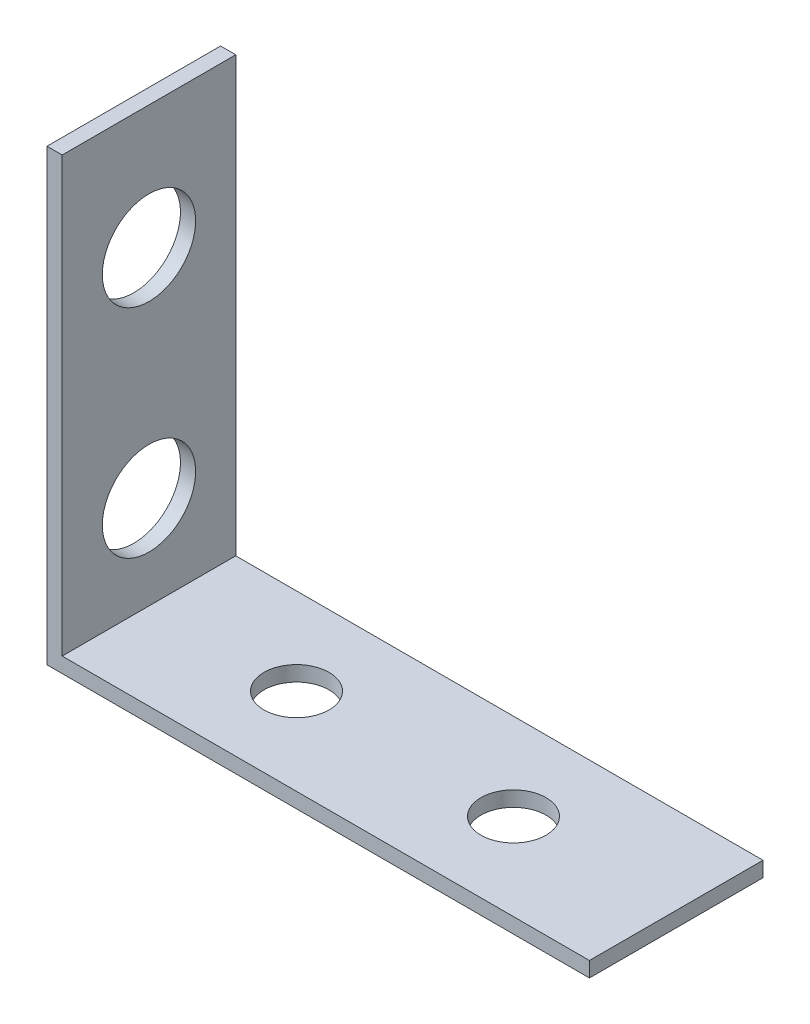
ISO-10303-21;
HEADER;
FILE_DESCRIPTION(('STEP AP214'),'2;1');
FILE_NAME('part.step','',(''),(''),'','','');
FILE_SCHEMA(('AUTOMOTIVE_DESIGN { 1 0 10303 214 1 1 1 1 }'));
ENDSEC;
DATA;
#1=APPLICATION_CONTEXT('core data for automotive mechanical design processes');
#2=APPLICATION_PROTOCOL_DEFINITION('international standard','automotive_design',2000,#1);
#3=PRODUCT_CONTEXT('',#1,'mechanical');
#4=PRODUCT('Part','Part','',(#3));
#5=PRODUCT_RELATED_PRODUCT_CATEGORY('part','',(#4));
#6=PRODUCT_DEFINITION_FORMATION('','',#4);
#7=PRODUCT_DEFINITION_CONTEXT('part definition',#1,'design');
#8=PRODUCT_DEFINITION('design','',#6,#7);
#9=PRODUCT_DEFINITION_SHAPE('','',#8);
#10=(LENGTH_UNIT() NAMED_UNIT(*) SI_UNIT(.MILLI.,.METRE.));
#11=(NAMED_UNIT(*) PLANE_ANGLE_UNIT() SI_UNIT($,.RADIAN.));
#12=(NAMED_UNIT(*) SI_UNIT($,.STERADIAN.) SOLID_ANGLE_UNIT());
#13=UNCERTAINTY_MEASURE_WITH_UNIT(LENGTH_MEASURE(1.E-05),#10,'distance_accuracy_value','');
#14=(GEOMETRIC_REPRESENTATION_CONTEXT(3) GLOBAL_UNCERTAINTY_ASSIGNED_CONTEXT((#13)) GLOBAL_UNIT_ASSIGNED_CONTEXT((#10,
#11,#12)) REPRESENTATION_CONTEXT('',''));
#15=CARTESIAN_POINT('',(0.,0.,0.));
#16=DIRECTION('',(0.,0.,1.));
#17=DIRECTION('',(1.,0.,0.));
#18=AXIS2_PLACEMENT_3D('',#15,#16,#17);
#19=CARTESIAN_POINT('',(12.5,0.7,0.));
#20=DIRECTION('',(1.,0.,0.));
#21=DIRECTION('',(0.,0.,-1.));
#22=AXIS2_PLACEMENT_3D('',#19,#20,#21);
#23=PLANE('',#22);
#24=DIRECTION('',(0.,0.,1.));
#25=VECTOR('',#24,1.);
#26=CARTESIAN_POINT('',(12.5,0.,0.));
#27=LINE('',#26,#25);
#28=CARTESIAN_POINT('',(12.5,0.,-8.00000000000001));
#29=VERTEX_POINT('',#28);
#30=CARTESIAN_POINT('',(12.5,0.,0.));
#31=VERTEX_POINT('',#30);
#32=EDGE_CURVE('E86',#29,#31,#27,.T.);
#33=ORIENTED_EDGE('',*,*,#32,.F.);
#34=DIRECTION('',(0.,-1.,0.));
#35=VECTOR('',#34,1.);
#36=CARTESIAN_POINT('',(12.5,0.7,-8.00000000000001));
#37=LINE('',#36,#35);
#38=CARTESIAN_POINT('',(12.5,0.7,-8.00000000000001));
#39=VERTEX_POINT('',#38);
#40=EDGE_CURVE('E11',#39,#29,#37,.T.);
#41=ORIENTED_EDGE('',*,*,#40,.F.);
#42=DIRECTION('',(0.,0.,1.));
#43=VECTOR('',#42,1.);
#44=CARTESIAN_POINT('',(12.5,0.7,0.));
#45=LINE('',#44,#43);
#46=CARTESIAN_POINT('',(12.5,0.7,0.));
#47=VERTEX_POINT('',#46);
#48=EDGE_CURVE('E88',#39,#47,#45,.T.);
#49=ORIENTED_EDGE('',*,*,#48,.T.);
#50=DIRECTION('',(0.,-1.,0.));
#51=VECTOR('',#50,1.);
#52=CARTESIAN_POINT('',(12.5,0.7,0.));
#53=LINE('',#52,#51);
#54=EDGE_CURVE('E82',#47,#31,#53,.T.);
#55=ORIENTED_EDGE('',*,*,#54,.T.);
#56=EDGE_LOOP('',(#33,#41,#49,#55));
#57=FACE_BOUND('',#56,.T.);
#58=ADVANCED_FACE('F41',(#57),#23,.T.);
#59=CARTESIAN_POINT('',(0.,0.7,-8.00000000000001));
#60=DIRECTION('',(0.,0.,-1.));
#61=DIRECTION('',(-1.,0.,0.));
#62=AXIS2_PLACEMENT_3D('',#59,#60,#61);
#63=PLANE('',#62);
#64=DIRECTION('',(1.,0.,0.));
#65=VECTOR('',#64,1.);
#66=CARTESIAN_POINT('',(0.,0.,-8.00000000000001));
#67=LINE('',#66,#65);
#68=CARTESIAN_POINT('',(-12.5,0.,-8.));
#69=VERTEX_POINT('',#68);
#70=EDGE_CURVE('E109',#69,#29,#67,.T.);
#71=ORIENTED_EDGE('',*,*,#70,.F.);
#72=DIRECTION('',(0.,-1.,0.));
#73=VECTOR('',#72,1.);
#74=CARTESIAN_POINT('',(-12.5,0.7,-8.));
#75=LINE('',#74,#73);
#76=CARTESIAN_POINT('',(-12.5,20.7,-8.));
#77=VERTEX_POINT('',#76);
#78=EDGE_CURVE('E50',#77,#69,#75,.T.);
#79=ORIENTED_EDGE('',*,*,#78,.F.);
#80=DIRECTION('',(-1.,0.,0.));
#81=VECTOR('',#80,1.);
#82=CARTESIAN_POINT('',(-12.5,20.7,-8.));
#83=LINE('',#82,#81);
#84=CARTESIAN_POINT('',(-11.8,20.7,-8.));
#85=VERTEX_POINT('',#84);
#86=EDGE_CURVE('E164',#85,#77,#83,.T.);
#87=ORIENTED_EDGE('',*,*,#86,.F.);
#88=DIRECTION('',(0.,-1.,0.));
#89=VECTOR('',#88,1.);
#90=CARTESIAN_POINT('',(-11.8,20.7,-8.));
#91=LINE('',#90,#89);
#92=CARTESIAN_POINT('',(-11.8,0.7,-8.));
#93=VERTEX_POINT('',#92);
#94=EDGE_CURVE('E117',#85,#93,#91,.T.);
#95=ORIENTED_EDGE('',*,*,#94,.T.);
#96=DIRECTION('',(1.,0.,0.));
#97=VECTOR('',#96,1.);
#98=CARTESIAN_POINT('',(0.,0.7,-8.00000000000001));
#99=LINE('',#98,#97);
#100=EDGE_CURVE('E175',#93,#39,#99,.T.);
#101=ORIENTED_EDGE('',*,*,#100,.T.);
#102=ORIENTED_EDGE('',*,*,#40,.T.);
#103=EDGE_LOOP('',(#71,#79,#87,#95,#101,#102));
#104=FACE_BOUND('',#103,.T.);
#105=ADVANCED_FACE('F208',(#104),#63,.T.);
#106=CARTESIAN_POINT('',(-12.5,0.7,0.));
#107=DIRECTION('',(1.,0.,0.));
#108=DIRECTION('',(0.,0.,-1.));
#109=AXIS2_PLACEMENT_3D('',#106,#107,#108);
#110=PLANE('',#109);
#111=CARTESIAN_POINT('',(-12.5,5.,-4.));
#112=DIRECTION('',(-1.,0.,0.));
#113=DIRECTION('',(0.,0.,1.));
#114=AXIS2_PLACEMENT_3D('',#111,#112,#113);
#115=CIRCLE('',#114,2.15);
#116=CARTESIAN_POINT('',(-12.5,5.,-1.85));
#117=VERTEX_POINT('',#116);
#118=EDGE_CURVE('E137',#117,#117,#115,.T.);
#119=ORIENTED_EDGE('',*,*,#118,.F.);
#120=EDGE_LOOP('',(#119));
#121=FACE_BOUND('',#120,.T.);
#122=CARTESIAN_POINT('',(-12.5,15.,-4.));
#123=DIRECTION('',(-1.,0.,0.));
#124=DIRECTION('',(0.,0.,1.));
#125=AXIS2_PLACEMENT_3D('',#122,#123,#124);
#126=CIRCLE('',#125,2.15);
#127=CARTESIAN_POINT('',(-12.5,15.,-1.85));
#128=VERTEX_POINT('',#127);
#129=EDGE_CURVE('E144',#128,#128,#126,.T.);
#130=ORIENTED_EDGE('',*,*,#129,.F.);
#131=EDGE_LOOP('',(#130));
#132=FACE_BOUND('',#131,.T.);
#133=DIRECTION('',(0.,0.,1.));
#134=VECTOR('',#133,1.);
#135=CARTESIAN_POINT('',(-12.5,0.,0.));
#136=LINE('',#135,#134);
#137=CARTESIAN_POINT('',(-12.5,0.,0.));
#138=VERTEX_POINT('',#137);
#139=EDGE_CURVE('E104',#69,#138,#136,.T.);
#140=ORIENTED_EDGE('',*,*,#139,.T.);
#141=DIRECTION('',(0.,-1.,0.));
#142=VECTOR('',#141,1.);
#143=CARTESIAN_POINT('',(-12.5,0.7,0.));
#144=LINE('',#143,#142);
#145=CARTESIAN_POINT('',(-12.5,20.7,0.));
#146=VERTEX_POINT('',#145);
#147=EDGE_CURVE('E91',#146,#138,#144,.T.);
#148=ORIENTED_EDGE('',*,*,#147,.F.);
#149=DIRECTION('',(0.,0.,1.));
#150=VECTOR('',#149,1.);
#151=CARTESIAN_POINT('',(-12.5,20.7,0.));
#152=LINE('',#151,#150);
#153=EDGE_CURVE('E152',#77,#146,#152,.T.);
#154=ORIENTED_EDGE('',*,*,#153,.F.);
#155=ORIENTED_EDGE('',*,*,#78,.T.);
#156=EDGE_LOOP('',(#140,#148,#154,#155));
#157=FACE_BOUND('',#156,.T.);
#158=ADVANCED_FACE('F212',(#121,#132,#157),#110,.F.);
#159=CARTESIAN_POINT('',(-5.00000000000001,0.7,-4.));
#160=DIRECTION('',(0.,-1.,0.));
#161=DIRECTION('',(0.,0.,-1.));
#162=AXIS2_PLACEMENT_3D('',#159,#160,#161);
#163=CYLINDRICAL_SURFACE('',#162,1.5);
#164=CARTESIAN_POINT('',(-5.00000000000001,0.7,-4.));
#165=DIRECTION('',(0.,1.,0.));
#166=DIRECTION('',(0.,0.,1.));
#167=AXIS2_PLACEMENT_3D('',#164,#165,#166);
#168=CIRCLE('',#167,1.5);
#169=CARTESIAN_POINT('',(-5.00000000000001,0.7,-2.5));
#170=VERTEX_POINT('',#169);
#171=EDGE_CURVE('E179',#170,#170,#168,.T.);
#172=ORIENTED_EDGE('',*,*,#171,.T.);
#173=EDGE_LOOP('',(#172));
#174=FACE_BOUND('',#173,.T.);
#175=CARTESIAN_POINT('',(-5.00000000000001,0.,-4.));
#176=DIRECTION('',(0.,1.,0.));
#177=DIRECTION('',(0.,0.,1.));
#178=AXIS2_PLACEMENT_3D('',#175,#176,#177);
#179=CIRCLE('',#178,1.5);
#180=CARTESIAN_POINT('',(-5.00000000000001,0.,-2.5));
#181=VERTEX_POINT('',#180);
#182=EDGE_CURVE('E103',#181,#181,#179,.T.);
#183=ORIENTED_EDGE('',*,*,#182,.F.);
#184=EDGE_LOOP('',(#183));
#185=FACE_BOUND('',#184,.T.);
#186=ADVANCED_FACE('F217',(#174,#185),#163,.F.);
#187=CARTESIAN_POINT('',(0.,0.7,0.));
#188=DIRECTION('',(0.,0.,-1.));
#189=DIRECTION('',(-1.,0.,0.));
#190=AXIS2_PLACEMENT_3D('',#187,#188,#189);
#191=PLANE('',#190);
#192=DIRECTION('',(1.,0.,0.));
#193=VECTOR('',#192,1.);
#194=CARTESIAN_POINT('',(0.,0.,0.));
#195=LINE('',#194,#193);
#196=EDGE_CURVE('E96',#138,#31,#195,.T.);
#197=ORIENTED_EDGE('',*,*,#196,.T.);
#198=ORIENTED_EDGE('',*,*,#54,.F.);
#199=DIRECTION('',(1.,0.,0.));
#200=VECTOR('',#199,1.);
#201=CARTESIAN_POINT('',(0.,0.7,0.));
#202=LINE('',#201,#200);
#203=CARTESIAN_POINT('',(-11.8,0.7,0.));
#204=VERTEX_POINT('',#203);
#205=EDGE_CURVE('E63',#204,#47,#202,.T.);
#206=ORIENTED_EDGE('',*,*,#205,.F.);
#207=DIRECTION('',(0.,-1.,0.));
#208=VECTOR('',#207,1.);
#209=CARTESIAN_POINT('',(-11.8,20.7,0.));
#210=LINE('',#209,#208);
#211=CARTESIAN_POINT('',(-11.8,20.7,0.));
#212=VERTEX_POINT('',#211);
#213=EDGE_CURVE('E111',#212,#204,#210,.T.);
#214=ORIENTED_EDGE('',*,*,#213,.F.);
#215=DIRECTION('',(1.,0.,0.));
#216=VECTOR('',#215,1.);
#217=CARTESIAN_POINT('',(-12.5,20.7,0.));
#218=LINE('',#217,#216);
#219=EDGE_CURVE('E156',#146,#212,#218,.T.);
#220=ORIENTED_EDGE('',*,*,#219,.F.);
#221=ORIENTED_EDGE('',*,*,#147,.T.);
#222=EDGE_LOOP('',(#197,#198,#206,#214,#220,#221));
#223=FACE_BOUND('',#222,.T.);
#224=ADVANCED_FACE('F97',(#223),#191,.F.);
#225=CARTESIAN_POINT('',(5.00000000000001,0.7,-4.));
#226=DIRECTION('',(0.,-1.,0.));
#227=DIRECTION('',(0.,0.,-1.));
#228=AXIS2_PLACEMENT_3D('',#225,#226,#227);
#229=CYLINDRICAL_SURFACE('',#228,1.5);
#230=CARTESIAN_POINT('',(5.00000000000001,0.7,-4.));
#231=DIRECTION('',(0.,1.,0.));
#232=DIRECTION('',(0.,0.,1.));
#233=AXIS2_PLACEMENT_3D('',#230,#231,#232);
#234=CIRCLE('',#233,1.5);
#235=CARTESIAN_POINT('',(5.00000000000001,0.7,-2.5));
#236=VERTEX_POINT('',#235);
#237=EDGE_CURVE('E92',#236,#236,#234,.F.);
#238=ORIENTED_EDGE('',*,*,#237,.F.);
#239=EDGE_LOOP('',(#238));
#240=FACE_BOUND('',#239,.T.);
#241=CARTESIAN_POINT('',(5.00000000000001,0.,-4.));
#242=DIRECTION('',(0.,1.,0.));
#243=DIRECTION('',(0.,0.,1.));
#244=AXIS2_PLACEMENT_3D('',#241,#242,#243);
#245=CIRCLE('',#244,1.5);
#246=CARTESIAN_POINT('',(5.00000000000001,0.,-2.5));
#247=VERTEX_POINT('',#246);
#248=EDGE_CURVE('E127',#247,#247,#245,.F.);
#249=ORIENTED_EDGE('',*,*,#248,.T.);
#250=EDGE_LOOP('',(#249));
#251=FACE_BOUND('',#250,.T.);
#252=ADVANCED_FACE('F190',(#240,#251),#229,.F.);
#253=CARTESIAN_POINT('',(0.,0.7,0.));
#254=DIRECTION('',(0.,1.,0.));
#255=DIRECTION('',(0.,0.,1.));
#256=AXIS2_PLACEMENT_3D('',#253,#254,#255);
#257=PLANE('',#256);
#258=DIRECTION('',(0.,0.,-1.));
#259=VECTOR('',#258,1.);
#260=CARTESIAN_POINT('',(-11.8,0.7,0.));
#261=LINE('',#260,#259);
#262=EDGE_CURVE('E58',#204,#93,#261,.T.);
#263=ORIENTED_EDGE('',*,*,#262,.F.);
#264=ORIENTED_EDGE('',*,*,#205,.T.);
#265=ORIENTED_EDGE('',*,*,#48,.F.);
#266=ORIENTED_EDGE('',*,*,#100,.F.);
#267=EDGE_LOOP('',(#263,#264,#265,#266));
#268=FACE_BOUND('',#267,.T.);
#269=ORIENTED_EDGE('',*,*,#171,.F.);
#270=EDGE_LOOP('',(#269));
#271=FACE_BOUND('',#270,.T.);
#272=ORIENTED_EDGE('',*,*,#237,.T.);
#273=EDGE_LOOP('',(#272));
#274=FACE_BOUND('',#273,.T.);
#275=ADVANCED_FACE('F188',(#268,#271,#274),#257,.T.);
#276=CARTESIAN_POINT('',(0.,0.,0.));
#277=DIRECTION('',(0.,1.,0.));
#278=DIRECTION('',(0.,0.,1.));
#279=AXIS2_PLACEMENT_3D('',#276,#277,#278);
#280=PLANE('',#279);
#281=ORIENTED_EDGE('',*,*,#32,.T.);
#282=ORIENTED_EDGE('',*,*,#196,.F.);
#283=ORIENTED_EDGE('',*,*,#139,.F.);
#284=ORIENTED_EDGE('',*,*,#70,.T.);
#285=EDGE_LOOP('',(#281,#282,#283,#284));
#286=FACE_BOUND('',#285,.T.);
#287=ORIENTED_EDGE('',*,*,#182,.T.);
#288=EDGE_LOOP('',(#287));
#289=FACE_BOUND('',#288,.T.);
#290=ORIENTED_EDGE('',*,*,#248,.F.);
#291=EDGE_LOOP('',(#290));
#292=FACE_BOUND('',#291,.T.);
#293=ADVANCED_FACE('F106',(#286,#289,#292),#280,.F.);
#294=CARTESIAN_POINT('',(-11.8,20.7,0.));
#295=DIRECTION('',(-1.,0.,0.));
#296=DIRECTION('',(0.,0.,1.));
#297=AXIS2_PLACEMENT_3D('',#294,#295,#296);
#298=PLANE('',#297);
#299=CARTESIAN_POINT('',(-11.8,5.,-4.));
#300=DIRECTION('',(-1.,0.,0.));
#301=DIRECTION('',(0.,0.,1.));
#302=AXIS2_PLACEMENT_3D('',#299,#300,#301);
#303=CIRCLE('',#302,2.15);
#304=CARTESIAN_POINT('',(-11.8,5.,-1.85));
#305=VERTEX_POINT('',#304);
#306=EDGE_CURVE('E44',#305,#305,#303,.T.);
#307=ORIENTED_EDGE('',*,*,#306,.T.);
#308=EDGE_LOOP('',(#307));
#309=FACE_BOUND('',#308,.T.);
#310=CARTESIAN_POINT('',(-11.8,15.,-4.));
#311=DIRECTION('',(-1.,0.,0.));
#312=DIRECTION('',(0.,0.,1.));
#313=AXIS2_PLACEMENT_3D('',#310,#311,#312);
#314=CIRCLE('',#313,2.15);
#315=CARTESIAN_POINT('',(-11.8,15.,-1.85));
#316=VERTEX_POINT('',#315);
#317=EDGE_CURVE('E134',#316,#316,#314,.T.);
#318=ORIENTED_EDGE('',*,*,#317,.T.);
#319=EDGE_LOOP('',(#318));
#320=FACE_BOUND('',#319,.T.);
#321=ORIENTED_EDGE('',*,*,#262,.T.);
#322=ORIENTED_EDGE('',*,*,#94,.F.);
#323=DIRECTION('',(0.,0.,-1.));
#324=VECTOR('',#323,1.);
#325=CARTESIAN_POINT('',(-11.8,20.7,0.));
#326=LINE('',#325,#324);
#327=EDGE_CURVE('E160',#212,#85,#326,.T.);
#328=ORIENTED_EDGE('',*,*,#327,.F.);
#329=ORIENTED_EDGE('',*,*,#213,.T.);
#330=EDGE_LOOP('',(#321,#322,#328,#329));
#331=FACE_BOUND('',#330,.T.);
#332=ADVANCED_FACE('F197',(#309,#320,#331),#298,.F.);
#333=CARTESIAN_POINT('',(0.,20.7,0.));
#334=DIRECTION('',(0.,-1.,0.));
#335=DIRECTION('',(0.,0.,-1.));
#336=AXIS2_PLACEMENT_3D('',#333,#334,#335);
#337=PLANE('',#336);
#338=ORIENTED_EDGE('',*,*,#153,.T.);
#339=ORIENTED_EDGE('',*,*,#219,.T.);
#340=ORIENTED_EDGE('',*,*,#327,.T.);
#341=ORIENTED_EDGE('',*,*,#86,.T.);
#342=EDGE_LOOP('',(#338,#339,#340,#341));
#343=FACE_BOUND('',#342,.T.);
#344=ADVANCED_FACE('F203',(#343),#337,.F.);
#345=CARTESIAN_POINT('',(12.5,15.,-4.00000000000001));
#346=DIRECTION('',(-1.,0.,0.));
#347=DIRECTION('',(0.,0.,1.));
#348=AXIS2_PLACEMENT_3D('',#345,#346,#347);
#349=CYLINDRICAL_SURFACE('',#348,2.15);
#350=CARTESIAN_POINT('',(-12.5,15.,-1.85));
#351=CARTESIAN_POINT('',(-12.4927083333333,15.,-1.85));
#352=CARTESIAN_POINT('',(-12.4854166666667,15.,-1.85));
#353=CARTESIAN_POINT('',(-12.4708333333333,15.,-1.85));
#354=CARTESIAN_POINT('',(-12.4635416666667,15.,-1.85));
#355=CARTESIAN_POINT('',(-12.4489583333333,15.,-1.85));
#356=CARTESIAN_POINT('',(-12.4416666666667,15.,-1.85));
#357=CARTESIAN_POINT('',(-12.4270833333333,15.,-1.85));
#358=CARTESIAN_POINT('',(-12.4197916666667,15.,-1.85));
#359=CARTESIAN_POINT('',(-12.4052083333333,15.,-1.85));
#360=CARTESIAN_POINT('',(-12.3979166666667,15.,-1.85));
#361=CARTESIAN_POINT('',(-12.3833333333333,15.,-1.85));
#362=CARTESIAN_POINT('',(-12.3760416666667,15.,-1.85));
#363=CARTESIAN_POINT('',(-12.3614583333333,15.,-1.85));
#364=CARTESIAN_POINT('',(-12.3541666666667,15.,-1.85));
#365=CARTESIAN_POINT('',(-12.3395833333333,15.,-1.85));
#366=CARTESIAN_POINT('',(-12.3322916666667,15.,-1.85));
#367=CARTESIAN_POINT('',(-12.3177083333333,15.,-1.85));
#368=CARTESIAN_POINT('',(-12.3104166666667,15.,-1.85));
#369=CARTESIAN_POINT('',(-12.2958333333333,15.,-1.85));
#370=CARTESIAN_POINT('',(-12.2885416666667,15.,-1.85));
#371=CARTESIAN_POINT('',(-12.2739583333333,15.,-1.85));
#372=CARTESIAN_POINT('',(-12.2666666666667,15.,-1.85));
#373=CARTESIAN_POINT('',(-12.2520833333333,15.,-1.85));
#374=CARTESIAN_POINT('',(-12.2447916666667,15.,-1.85));
#375=CARTESIAN_POINT('',(-12.2302083333333,15.,-1.85));
#376=CARTESIAN_POINT('',(-12.2229166666667,15.,-1.85));
#377=CARTESIAN_POINT('',(-12.2083333333333,15.,-1.85));
#378=CARTESIAN_POINT('',(-12.2010416666667,15.,-1.85));
#379=CARTESIAN_POINT('',(-12.1864583333333,15.,-1.85));
#380=CARTESIAN_POINT('',(-12.1791666666667,15.,-1.85));
#381=CARTESIAN_POINT('',(-12.1645833333333,15.,-1.85));
#382=CARTESIAN_POINT('',(-12.1572916666667,15.,-1.85));
#383=CARTESIAN_POINT('',(-12.1427083333333,15.,-1.85));
#384=CARTESIAN_POINT('',(-12.1354166666667,15.,-1.85));
#385=CARTESIAN_POINT('',(-12.1208333333333,15.,-1.85));
#386=CARTESIAN_POINT('',(-12.1135416666667,15.,-1.85));
#387=CARTESIAN_POINT('',(-12.0989583333333,15.,-1.85));
#388=CARTESIAN_POINT('',(-12.0916666666667,15.,-1.85));
#389=CARTESIAN_POINT('',(-12.0770833333333,15.,-1.85));
#390=CARTESIAN_POINT('',(-12.0697916666667,15.,-1.85));
#391=CARTESIAN_POINT('',(-12.0552083333333,15.,-1.85));
#392=CARTESIAN_POINT('',(-12.0479166666667,15.,-1.85));
#393=CARTESIAN_POINT('',(-12.0333333333333,15.,-1.85));
#394=CARTESIAN_POINT('',(-12.0260416666667,15.,-1.85));
#395=CARTESIAN_POINT('',(-12.0114583333333,15.,-1.85));
#396=CARTESIAN_POINT('',(-12.0041666666667,15.,-1.85));
#397=CARTESIAN_POINT('',(-11.9895833333333,15.,-1.85));
#398=CARTESIAN_POINT('',(-11.9822916666667,15.,-1.85));
#399=CARTESIAN_POINT('',(-11.9677083333333,15.,-1.85));
#400=CARTESIAN_POINT('',(-11.9604166666667,15.,-1.85));
#401=CARTESIAN_POINT('',(-11.9458333333333,15.,-1.85));
#402=CARTESIAN_POINT('',(-11.9385416666667,15.,-1.85));
#403=CARTESIAN_POINT('',(-11.9239583333333,15.,-1.85));
#404=CARTESIAN_POINT('',(-11.9166666666667,15.,-1.85));
#405=CARTESIAN_POINT('',(-11.9020833333333,15.,-1.85));
#406=CARTESIAN_POINT('',(-11.8947916666667,15.,-1.85));
#407=CARTESIAN_POINT('',(-11.8802083333333,15.,-1.85));
#408=CARTESIAN_POINT('',(-11.8729166666667,15.,-1.85));
#409=CARTESIAN_POINT('',(-11.8583333333333,15.,-1.85));
#410=CARTESIAN_POINT('',(-11.8510416666667,15.,-1.85));
#411=CARTESIAN_POINT('',(-11.8364583333333,15.,-1.85));
#412=CARTESIAN_POINT('',(-11.8291666666667,15.,-1.85));
#413=CARTESIAN_POINT('',(-11.8145833333333,15.,-1.85));
#414=CARTESIAN_POINT('',(-11.8072916666667,15.,-1.85));
#415=CARTESIAN_POINT('',(-11.8,15.,-1.85));
#416=B_SPLINE_CURVE_WITH_KNOTS('',3,(#350,#351,#352,#353,#354,#355,#356,#357,#358,#359,#360,
#361,#362,#363,#364,#365,#366,#367,#368,#369,#370,#371,#372,#373,#374,#375,#376,#377,#378,#379,
#380,#381,#382,#383,#384,#385,#386,#387,#388,#389,#390,#391,#392,#393,#394,#395,#396,#397,#398,
#399,#400,#401,#402,#403,#404,#405,#406,#407,#408,#409,#410,#411,#412,#413,#414,#415),
.UNSPECIFIED.,.F.,.F.,(4,2,2,2,2,2,2,2,2,2,2,2,2,2,2,2,2,2,2,2,2,2,2,2,2,2,2,2,2,2,2,2,4),(0.,
0.0218750000000011,0.0437499999999987,0.0656249999999997,0.0875000000000008,0.109374999999998,
0.131249999999999,0.153125,0.175000000000002,0.196874999999999,0.21875,0.240625000000001,
0.262499999999999,0.284375,0.306250000000001,0.328124999999999,0.35,0.371875000000001,
0.393749999999998,0.415624999999999,0.4375,0.459374999999998,0.481249999999999,0.503125,
0.524999999999998,0.546874999999999,0.56875,0.590625000000001,0.612499999999998,
0.634374999999999,0.656250000000001,0.678124999999998,0.699999999999999),.UNSPECIFIED.);
#417=EDGE_CURVE('BSEAM252',#128,#316,#416,.T.);
#418=ORIENTED_EDGE('',*,*,#129,.T.);
#419=ORIENTED_EDGE('',*,*,#317,.F.);
#420=ORIENTED_EDGE('',*,*,#417,.T.);
#421=ORIENTED_EDGE('',*,*,#417,.F.);
#422=EDGE_LOOP('',(#418,#420,#419,#421));
#423=FACE_BOUND('',#422,.T.);
#424=ADVANCED_FACE('F252',(#423),#349,.F.);
#425=CARTESIAN_POINT('',(12.5,5.,-4.));
#426=DIRECTION('',(-1.,0.,0.));
#427=DIRECTION('',(0.,0.,1.));
#428=AXIS2_PLACEMENT_3D('',#425,#426,#427);
#429=CYLINDRICAL_SURFACE('',#428,2.15);
#430=CARTESIAN_POINT('',(-12.5,5.,-1.85));
#431=CARTESIAN_POINT('',(-12.4927083333333,5.,-1.85));
#432=CARTESIAN_POINT('',(-12.4854166666667,5.,-1.85));
#433=CARTESIAN_POINT('',(-12.4708333333333,5.,-1.85));
#434=CARTESIAN_POINT('',(-12.4635416666667,5.,-1.85));
#435=CARTESIAN_POINT('',(-12.4489583333333,5.,-1.85));
#436=CARTESIAN_POINT('',(-12.4416666666667,5.,-1.85));
#437=CARTESIAN_POINT('',(-12.4270833333333,5.,-1.85));
#438=CARTESIAN_POINT('',(-12.4197916666667,5.,-1.85));
#439=CARTESIAN_POINT('',(-12.4052083333333,5.,-1.85));
#440=CARTESIAN_POINT('',(-12.3979166666667,5.,-1.85));
#441=CARTESIAN_POINT('',(-12.3833333333333,5.,-1.85));
#442=CARTESIAN_POINT('',(-12.3760416666667,5.,-1.85));
#443=CARTESIAN_POINT('',(-12.3614583333333,5.,-1.85));
#444=CARTESIAN_POINT('',(-12.3541666666667,5.,-1.85));
#445=CARTESIAN_POINT('',(-12.3395833333333,5.,-1.85));
#446=CARTESIAN_POINT('',(-12.3322916666667,5.,-1.85));
#447=CARTESIAN_POINT('',(-12.3177083333333,5.,-1.85));
#448=CARTESIAN_POINT('',(-12.3104166666667,5.,-1.85));
#449=CARTESIAN_POINT('',(-12.2958333333333,5.,-1.85));
#450=CARTESIAN_POINT('',(-12.2885416666667,5.,-1.85));
#451=CARTESIAN_POINT('',(-12.2739583333333,5.,-1.85));
#452=CARTESIAN_POINT('',(-12.2666666666667,5.,-1.85));
#453=CARTESIAN_POINT('',(-12.2520833333333,5.,-1.85));
#454=CARTESIAN_POINT('',(-12.2447916666667,5.,-1.85));
#455=CARTESIAN_POINT('',(-12.2302083333333,5.,-1.85));
#456=CARTESIAN_POINT('',(-12.2229166666667,5.,-1.85));
#457=CARTESIAN_POINT('',(-12.2083333333333,5.,-1.85));
#458=CARTESIAN_POINT('',(-12.2010416666667,5.,-1.85));
#459=CARTESIAN_POINT('',(-12.1864583333333,5.,-1.85));
#460=CARTESIAN_POINT('',(-12.1791666666667,5.,-1.85));
#461=CARTESIAN_POINT('',(-12.1645833333333,5.,-1.85));
#462=CARTESIAN_POINT('',(-12.1572916666667,5.,-1.85));
#463=CARTESIAN_POINT('',(-12.1427083333333,5.,-1.85));
#464=CARTESIAN_POINT('',(-12.1354166666667,5.,-1.85));
#465=CARTESIAN_POINT('',(-12.1208333333333,5.,-1.85));
#466=CARTESIAN_POINT('',(-12.1135416666667,5.,-1.85));
#467=CARTESIAN_POINT('',(-12.0989583333333,5.,-1.85));
#468=CARTESIAN_POINT('',(-12.0916666666667,5.,-1.85));
#469=CARTESIAN_POINT('',(-12.0770833333333,5.,-1.85));
#470=CARTESIAN_POINT('',(-12.0697916666667,5.,-1.85));
#471=CARTESIAN_POINT('',(-12.0552083333333,5.,-1.85));
#472=CARTESIAN_POINT('',(-12.0479166666667,5.,-1.85));
#473=CARTESIAN_POINT('',(-12.0333333333333,5.,-1.85));
#474=CARTESIAN_POINT('',(-12.0260416666667,5.,-1.85));
#475=CARTESIAN_POINT('',(-12.0114583333333,5.,-1.85));
#476=CARTESIAN_POINT('',(-12.0041666666667,5.,-1.85));
#477=CARTESIAN_POINT('',(-11.9895833333333,5.,-1.85));
#478=CARTESIAN_POINT('',(-11.9822916666667,5.,-1.85));
#479=CARTESIAN_POINT('',(-11.9677083333333,5.,-1.85));
#480=CARTESIAN_POINT('',(-11.9604166666667,5.,-1.85));
#481=CARTESIAN_POINT('',(-11.9458333333333,5.,-1.85));
#482=CARTESIAN_POINT('',(-11.9385416666667,5.,-1.85));
#483=CARTESIAN_POINT('',(-11.9239583333333,5.,-1.85));
#484=CARTESIAN_POINT('',(-11.9166666666667,5.,-1.85));
#485=CARTESIAN_POINT('',(-11.9020833333333,5.,-1.85));
#486=CARTESIAN_POINT('',(-11.8947916666667,5.,-1.85));
#487=CARTESIAN_POINT('',(-11.8802083333333,5.,-1.85));
#488=CARTESIAN_POINT('',(-11.8729166666667,5.,-1.85));
#489=CARTESIAN_POINT('',(-11.8583333333333,5.,-1.85));
#490=CARTESIAN_POINT('',(-11.8510416666667,5.,-1.85));
#491=CARTESIAN_POINT('',(-11.8364583333333,5.,-1.85));
#492=CARTESIAN_POINT('',(-11.8291666666667,5.,-1.85));
#493=CARTESIAN_POINT('',(-11.8145833333333,5.,-1.85));
#494=CARTESIAN_POINT('',(-11.8072916666667,5.,-1.85));
#495=CARTESIAN_POINT('',(-11.8,5.,-1.85));
#496=B_SPLINE_CURVE_WITH_KNOTS('',3,(#430,#431,#432,#433,#434,#435,#436,#437,#438,#439,#440,
#441,#442,#443,#444,#445,#446,#447,#448,#449,#450,#451,#452,#453,#454,#455,#456,#457,#458,#459,
#460,#461,#462,#463,#464,#465,#466,#467,#468,#469,#470,#471,#472,#473,#474,#475,#476,#477,#478,
#479,#480,#481,#482,#483,#484,#485,#486,#487,#488,#489,#490,#491,#492,#493,#494,#495),
.UNSPECIFIED.,.F.,.F.,(4,2,2,2,2,2,2,2,2,2,2,2,2,2,2,2,2,2,2,2,2,2,2,2,2,2,2,2,2,2,2,2,4),(0.,
0.0218750000000011,0.0437499999999987,0.0656249999999997,0.0875000000000008,0.109374999999998,
0.131249999999999,0.153125,0.175000000000002,0.196874999999999,0.21875,0.240625000000001,
0.262499999999999,0.284375,0.306250000000001,0.328124999999999,0.35,0.371875000000001,
0.393749999999998,0.415624999999999,0.4375,0.459374999999998,0.481249999999999,0.503125,
0.524999999999998,0.546874999999999,0.56875,0.590625000000001,0.612499999999998,
0.634374999999999,0.656250000000001,0.678124999999998,0.699999999999999),.UNSPECIFIED.);
#497=EDGE_CURVE('BSEAM275',#117,#305,#496,.T.);
#498=ORIENTED_EDGE('',*,*,#118,.T.);
#499=ORIENTED_EDGE('',*,*,#306,.F.);
#500=ORIENTED_EDGE('',*,*,#497,.T.);
#501=ORIENTED_EDGE('',*,*,#497,.F.);
#502=EDGE_LOOP('',(#498,#500,#499,#501));
#503=FACE_BOUND('',#502,.T.);
#504=ADVANCED_FACE('F275',(#503),#429,.F.);
#505=CLOSED_SHELL('',(#58,#105,#158,#186,#224,#252,#275,#293,#332,#344,#424,#504));
#506=MANIFOLD_SOLID_BREP('B2',#505);
#507=ADVANCED_BREP_SHAPE_REPRESENTATION('',(#18,#506),#14);
#508=SHAPE_DEFINITION_REPRESENTATION(#9,#507);
ENDSEC;
END-ISO-10303-21;
